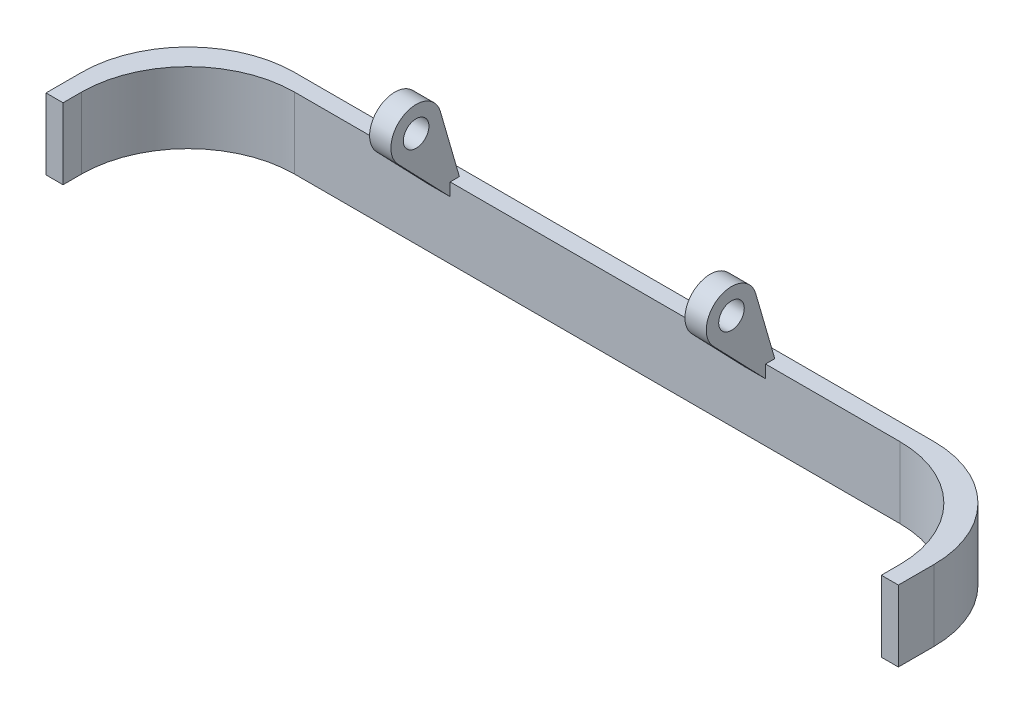
ISO-10303-21;
HEADER;
FILE_DESCRIPTION(('STEP AP214'),'2;1');
FILE_NAME('part.step','',(''),(''),'','','');
FILE_SCHEMA(('AUTOMOTIVE_DESIGN { 1 0 10303 214 1 1 1 1 }'));
ENDSEC;
DATA;
#1=APPLICATION_CONTEXT('core data for automotive mechanical design processes');
#2=APPLICATION_PROTOCOL_DEFINITION('international standard','automotive_design',2000,#1);
#3=PRODUCT_CONTEXT('',#1,'mechanical');
#4=PRODUCT('Part','Part','',(#3));
#5=PRODUCT_RELATED_PRODUCT_CATEGORY('part','',(#4));
#6=PRODUCT_DEFINITION_FORMATION('','',#4);
#7=PRODUCT_DEFINITION_CONTEXT('part definition',#1,'design');
#8=PRODUCT_DEFINITION('design','',#6,#7);
#9=PRODUCT_DEFINITION_SHAPE('','',#8);
#10=(LENGTH_UNIT() NAMED_UNIT(*) SI_UNIT(.MILLI.,.METRE.));
#11=(NAMED_UNIT(*) PLANE_ANGLE_UNIT() SI_UNIT($,.RADIAN.));
#12=(NAMED_UNIT(*) SI_UNIT($,.STERADIAN.) SOLID_ANGLE_UNIT());
#13=UNCERTAINTY_MEASURE_WITH_UNIT(LENGTH_MEASURE(1.E-05),#10,'distance_accuracy_value','');
#14=(GEOMETRIC_REPRESENTATION_CONTEXT(3) GLOBAL_UNCERTAINTY_ASSIGNED_CONTEXT((#13)) GLOBAL_UNIT_ASSIGNED_CONTEXT((#10,
#11,#12)) REPRESENTATION_CONTEXT('',''));
#15=CARTESIAN_POINT('',(0.,0.,0.));
#16=DIRECTION('',(0.,0.,1.));
#17=DIRECTION('',(1.,0.,0.));
#18=AXIS2_PLACEMENT_3D('',#15,#16,#17);
#19=CARTESIAN_POINT('',(17.4,10.,-17.6));
#20=DIRECTION('',(0.,0.,-1.));
#21=DIRECTION('',(-1.,0.,0.));
#22=AXIS2_PLACEMENT_3D('',#19,#20,#21);
#23=PLANE('',#22);
#24=DIRECTION('',(1.,0.,0.));
#25=VECTOR('',#24,1.);
#26=CARTESIAN_POINT('',(36.3,8.19852648959341,-17.599999999959));
#27=LINE('',#26,#25);
#28=CARTESIAN_POINT('',(36.3,8.19852648946349,-17.6));
#29=VERTEX_POINT('',#28);
#30=CARTESIAN_POINT('',(39.3,8.19852648959341,-17.6));
#31=VERTEX_POINT('',#30);
#32=EDGE_CURVE('E97',#29,#31,#27,.T.);
#33=ORIENTED_EDGE('',*,*,#32,.F.);
#34=DIRECTION('',(0.,1.,0.));
#35=VECTOR('',#34,1.);
#36=CARTESIAN_POINT('',(36.3,-291577.437540496,-17.6000000000158));
#37=LINE('',#36,#35);
#38=CARTESIAN_POINT('',(36.3,10.,-17.6));
#39=VERTEX_POINT('',#38);
#40=EDGE_CURVE('E257',#29,#39,#37,.T.);
#41=ORIENTED_EDGE('',*,*,#40,.T.);
#42=DIRECTION('',(1.,0.,0.));
#43=VECTOR('',#42,1.);
#44=CARTESIAN_POINT('',(17.4,10.,-17.6));
#45=LINE('',#44,#43);
#46=CARTESIAN_POINT('',(17.4,10.,-17.6));
#47=VERTEX_POINT('',#46);
#48=EDGE_CURVE('E320',#47,#39,#45,.T.);
#49=ORIENTED_EDGE('',*,*,#48,.F.);
#50=DIRECTION('',(0.,-1.,0.));
#51=VECTOR('',#50,1.);
#52=CARTESIAN_POINT('',(17.4,10.,-17.6));
#53=LINE('',#52,#51);
#54=CARTESIAN_POINT('',(17.4,0.,-17.6));
#55=VERTEX_POINT('',#54);
#56=EDGE_CURVE('E390',#47,#55,#53,.T.);
#57=ORIENTED_EDGE('',*,*,#56,.T.);
#58=DIRECTION('',(1.,0.,0.));
#59=VECTOR('',#58,1.);
#60=CARTESIAN_POINT('',(17.4,0.,-17.6));
#61=LINE('',#60,#59);
#62=CARTESIAN_POINT('',(102.6,0.,-17.6));
#63=VERTEX_POINT('',#62);
#64=EDGE_CURVE('E347',#55,#63,#61,.T.);
#65=ORIENTED_EDGE('',*,*,#64,.T.);
#66=DIRECTION('',(0.,-1.,0.));
#67=VECTOR('',#66,1.);
#68=CARTESIAN_POINT('',(102.6,10.,-17.6));
#69=LINE('',#68,#67);
#70=CARTESIAN_POINT('',(102.6,10.,-17.6));
#71=VERTEX_POINT('',#70);
#72=EDGE_CURVE('E387',#71,#63,#69,.T.);
#73=ORIENTED_EDGE('',*,*,#72,.F.);
#74=CARTESIAN_POINT('',(83.7,10.,-17.6));
#75=VERTEX_POINT('',#74);
#76=EDGE_CURVE('E319',#75,#71,#45,.T.);
#77=ORIENTED_EDGE('',*,*,#76,.F.);
#78=DIRECTION('',(0.,-1.,0.));
#79=VECTOR('',#78,1.);
#80=CARTESIAN_POINT('',(83.7,0.,-17.6));
#81=LINE('',#80,#79);
#82=CARTESIAN_POINT('',(83.7,8.19852648953336,-17.6));
#83=VERTEX_POINT('',#82);
#84=EDGE_CURVE('E284',#75,#83,#81,.T.);
#85=ORIENTED_EDGE('',*,*,#84,.T.);
#86=DIRECTION('',(-1.,0.,0.));
#87=VECTOR('',#86,1.);
#88=CARTESIAN_POINT('',(83.7,8.19852648953336,-17.6));
#89=LINE('',#88,#87);
#90=CARTESIAN_POINT('',(80.7,8.19852648953336,-17.6));
#91=VERTEX_POINT('',#90);
#92=EDGE_CURVE('E303',#83,#91,#89,.T.);
#93=ORIENTED_EDGE('',*,*,#92,.T.);
#94=DIRECTION('',(0.,-1.,0.));
#95=VECTOR('',#94,1.);
#96=CARTESIAN_POINT('',(80.7,0.,-17.6));
#97=LINE('',#96,#95);
#98=CARTESIAN_POINT('',(80.7,10.,-17.6));
#99=VERTEX_POINT('',#98);
#100=EDGE_CURVE('E297',#99,#91,#97,.T.);
#101=ORIENTED_EDGE('',*,*,#100,.F.);
#102=CARTESIAN_POINT('',(39.3,10.,-17.6));
#103=VERTEX_POINT('',#102);
#104=EDGE_CURVE('E324',#103,#99,#45,.T.);
#105=ORIENTED_EDGE('',*,*,#104,.F.);
#106=DIRECTION('',(0.,1.,0.));
#107=VECTOR('',#106,1.);
#108=CARTESIAN_POINT('',(39.3,-291577.437540496,-17.6000000000158));
#109=LINE('',#108,#107);
#110=EDGE_CURVE('E102',#31,#103,#109,.T.);
#111=ORIENTED_EDGE('',*,*,#110,.F.);
#112=EDGE_LOOP('',(#33,#41,#49,#57,#65,#73,#77,#85,#93,#101,#105,#111));
#113=FACE_BOUND('',#112,.T.);
#114=ADVANCED_FACE('F81',(#113),#23,.F.);
#115=CARTESIAN_POINT('',(15.,10.,-5.));
#116=DIRECTION('',(0.,-1.,0.));
#117=DIRECTION('',(0.,0.,-1.));
#118=AXIS2_PLACEMENT_3D('',#115,#116,#117);
#119=PLANE('',#118);
#120=ORIENTED_EDGE('',*,*,#48,.T.);
#121=DIRECTION('',(0.,0.,1.));
#122=VECTOR('',#121,1.);
#123=CARTESIAN_POINT('',(36.3,9.99999999999091,-400012.724171979));
#124=LINE('',#123,#122);
#125=CARTESIAN_POINT('',(36.3,10.,-18.9000000000499));
#126=VERTEX_POINT('',#125);
#127=EDGE_CURVE('E255',#126,#39,#124,.T.);
#128=ORIENTED_EDGE('',*,*,#127,.F.);
#129=DIRECTION('',(1.,0.,0.));
#130=VECTOR('',#129,1.);
#131=CARTESIAN_POINT('',(36.3,9.99999999999091,-18.9000000000306));
#132=LINE('',#131,#130);
#133=CARTESIAN_POINT('',(39.3,9.99999999999091,-18.9000000000306));
#134=VERTEX_POINT('',#133);
#135=EDGE_CURVE('E252',#126,#134,#132,.T.);
#136=ORIENTED_EDGE('',*,*,#135,.T.);
#137=DIRECTION('',(0.,0.,1.));
#138=VECTOR('',#137,1.);
#139=CARTESIAN_POINT('',(39.3,9.99999999999091,-400012.724171979));
#140=LINE('',#139,#138);
#141=EDGE_CURVE('E263',#134,#103,#140,.T.);
#142=ORIENTED_EDGE('',*,*,#141,.T.);
#143=ORIENTED_EDGE('',*,*,#104,.T.);
#144=DIRECTION('',(0.,0.,-1.));
#145=VECTOR('',#144,1.);
#146=CARTESIAN_POINT('',(80.7,10.,0.));
#147=LINE('',#146,#145);
#148=CARTESIAN_POINT('',(80.7,10.,-18.9));
#149=VERTEX_POINT('',#148);
#150=EDGE_CURVE('E279',#99,#149,#147,.T.);
#151=ORIENTED_EDGE('',*,*,#150,.T.);
#152=DIRECTION('',(-1.,0.,0.));
#153=VECTOR('',#152,1.);
#154=CARTESIAN_POINT('',(83.7,10.,-18.9));
#155=LINE('',#154,#153);
#156=CARTESIAN_POINT('',(83.7,10.,-18.9));
#157=VERTEX_POINT('',#156);
#158=EDGE_CURVE('E289',#157,#149,#155,.T.);
#159=ORIENTED_EDGE('',*,*,#158,.F.);
#160=DIRECTION('',(0.,0.,-1.));
#161=VECTOR('',#160,1.);
#162=CARTESIAN_POINT('',(83.7,10.,0.));
#163=LINE('',#162,#161);
#164=EDGE_CURVE('E287',#75,#157,#163,.T.);
#165=ORIENTED_EDGE('',*,*,#164,.F.);
#166=ORIENTED_EDGE('',*,*,#76,.T.);
#167=CARTESIAN_POINT('',(102.6,10.,-2.6));
#168=DIRECTION('',(0.,-1.,0.));
#169=DIRECTION('',(0.,0.,-1.));
#170=AXIS2_PLACEMENT_3D('',#167,#168,#169);
#171=CIRCLE('',#170,15.);
#172=CARTESIAN_POINT('',(117.6,10.,-2.6));
#173=VERTEX_POINT('',#172);
#174=EDGE_CURVE('E323',#71,#173,#171,.T.);
#175=ORIENTED_EDGE('',*,*,#174,.T.);
#176=DIRECTION('',(0.,0.,1.));
#177=VECTOR('',#176,1.);
#178=CARTESIAN_POINT('',(117.6,10.,-2.6));
#179=LINE('',#178,#177);
#180=CARTESIAN_POINT('',(117.6,10.,0.));
#181=VERTEX_POINT('',#180);
#182=EDGE_CURVE('E326',#173,#181,#179,.T.);
#183=ORIENTED_EDGE('',*,*,#182,.T.);
#184=DIRECTION('',(1.,0.,0.));
#185=VECTOR('',#184,1.);
#186=CARTESIAN_POINT('',(120.,10.,0.));
#187=LINE('',#186,#185);
#188=CARTESIAN_POINT('',(120.,10.,0.));
#189=VERTEX_POINT('',#188);
#190=EDGE_CURVE('E328',#181,#189,#187,.T.);
#191=ORIENTED_EDGE('',*,*,#190,.T.);
#192=DIRECTION('',(0.,0.,-1.));
#193=VECTOR('',#192,1.);
#194=CARTESIAN_POINT('',(120.,10.,-5.));
#195=LINE('',#194,#193);
#196=CARTESIAN_POINT('',(120.,10.,-5.));
#197=VERTEX_POINT('',#196);
#198=EDGE_CURVE('E330',#189,#197,#195,.T.);
#199=ORIENTED_EDGE('',*,*,#198,.T.);
#200=CARTESIAN_POINT('',(105.,10.,-5.));
#201=DIRECTION('',(0.,1.,0.));
#202=DIRECTION('',(0.,0.,-1.));
#203=AXIS2_PLACEMENT_3D('',#200,#201,#202);
#204=CIRCLE('',#203,15.);
#205=CARTESIAN_POINT('',(105.,10.,-20.));
#206=VERTEX_POINT('',#205);
#207=EDGE_CURVE('E332',#197,#206,#204,.T.);
#208=ORIENTED_EDGE('',*,*,#207,.T.);
#209=DIRECTION('',(-1.,0.,0.));
#210=VECTOR('',#209,1.);
#211=CARTESIAN_POINT('',(15.,10.,-20.));
#212=LINE('',#211,#210);
#213=CARTESIAN_POINT('',(15.,10.,-20.));
#214=VERTEX_POINT('',#213);
#215=EDGE_CURVE('E334',#206,#214,#212,.T.);
#216=ORIENTED_EDGE('',*,*,#215,.T.);
#217=CARTESIAN_POINT('',(15.,10.,-5.));
#218=DIRECTION('',(0.,1.,0.));
#219=DIRECTION('',(0.,0.,-1.));
#220=AXIS2_PLACEMENT_3D('',#217,#218,#219);
#221=CIRCLE('',#220,15.);
#222=CARTESIAN_POINT('',(0.,10.,-5.));
#223=VERTEX_POINT('',#222);
#224=EDGE_CURVE('E336',#214,#223,#221,.T.);
#225=ORIENTED_EDGE('',*,*,#224,.T.);
#226=DIRECTION('',(0.,0.,1.));
#227=VECTOR('',#226,1.);
#228=CARTESIAN_POINT('',(0.,10.,0.));
#229=LINE('',#228,#227);
#230=CARTESIAN_POINT('',(0.,10.,0.));
#231=VERTEX_POINT('',#230);
#232=EDGE_CURVE('E338',#223,#231,#229,.T.);
#233=ORIENTED_EDGE('',*,*,#232,.T.);
#234=DIRECTION('',(1.,0.,0.));
#235=VECTOR('',#234,1.);
#236=CARTESIAN_POINT('',(2.4,10.,0.));
#237=LINE('',#236,#235);
#238=CARTESIAN_POINT('',(2.4,10.,0.));
#239=VERTEX_POINT('',#238);
#240=EDGE_CURVE('E311',#231,#239,#237,.T.);
#241=ORIENTED_EDGE('',*,*,#240,.T.);
#242=DIRECTION('',(0.,0.,-1.));
#243=VECTOR('',#242,1.);
#244=CARTESIAN_POINT('',(2.4,10.,0.));
#245=LINE('',#244,#243);
#246=CARTESIAN_POINT('',(2.4,10.,-2.6));
#247=VERTEX_POINT('',#246);
#248=EDGE_CURVE('E314',#239,#247,#245,.T.);
#249=ORIENTED_EDGE('',*,*,#248,.T.);
#250=CARTESIAN_POINT('',(17.4,10.,-2.6));
#251=DIRECTION('',(0.,-1.,0.));
#252=DIRECTION('',(0.,0.,-1.));
#253=AXIS2_PLACEMENT_3D('',#250,#251,#252);
#254=CIRCLE('',#253,15.);
#255=EDGE_CURVE('E317',#247,#47,#254,.T.);
#256=ORIENTED_EDGE('',*,*,#255,.T.);
#257=EDGE_LOOP('',(#120,#128,#136,#142,#143,#151,#159,#165,#166,#175,#183,#191,#199,#208,#216,
#225,#233,#241,#249,#256));
#258=FACE_BOUND('',#257,.T.);
#259=ADVANCED_FACE('F416',(#258),#119,.F.);
#260=CARTESIAN_POINT('',(2.4,10.,0.));
#261=DIRECTION('',(0.,0.,-1.));
#262=DIRECTION('',(-1.,0.,0.));
#263=AXIS2_PLACEMENT_3D('',#260,#261,#262);
#264=PLANE('',#263);
#265=DIRECTION('',(1.,0.,0.));
#266=VECTOR('',#265,1.);
#267=CARTESIAN_POINT('',(2.4,0.,0.));
#268=LINE('',#267,#266);
#269=CARTESIAN_POINT('',(0.,0.,0.));
#270=VERTEX_POINT('',#269);
#271=CARTESIAN_POINT('',(2.4,0.,0.));
#272=VERTEX_POINT('',#271);
#273=EDGE_CURVE('E310',#270,#272,#268,.T.);
#274=ORIENTED_EDGE('',*,*,#273,.T.);
#275=DIRECTION('',(0.,-1.,0.));
#276=VECTOR('',#275,1.);
#277=CARTESIAN_POINT('',(2.4,10.,0.));
#278=LINE('',#277,#276);
#279=EDGE_CURVE('E12',#239,#272,#278,.T.);
#280=ORIENTED_EDGE('',*,*,#279,.F.);
#281=ORIENTED_EDGE('',*,*,#240,.F.);
#282=DIRECTION('',(0.,-1.,0.));
#283=VECTOR('',#282,1.);
#284=CARTESIAN_POINT('',(0.,10.,0.));
#285=LINE('',#284,#283);
#286=EDGE_CURVE('E340',#231,#270,#285,.T.);
#287=ORIENTED_EDGE('',*,*,#286,.T.);
#288=EDGE_LOOP('',(#274,#280,#281,#287));
#289=FACE_BOUND('',#288,.T.);
#290=ADVANCED_FACE('F83',(#289),#264,.F.);
#291=CARTESIAN_POINT('',(2.4,10.,0.));
#292=DIRECTION('',(-1.,0.,0.));
#293=DIRECTION('',(0.,0.,1.));
#294=AXIS2_PLACEMENT_3D('',#291,#292,#293);
#295=PLANE('',#294);
#296=DIRECTION('',(0.,0.,-1.));
#297=VECTOR('',#296,1.);
#298=CARTESIAN_POINT('',(2.4,0.,0.));
#299=LINE('',#298,#297);
#300=CARTESIAN_POINT('',(2.4,0.,-2.6));
#301=VERTEX_POINT('',#300);
#302=EDGE_CURVE('E343',#272,#301,#299,.T.);
#303=ORIENTED_EDGE('',*,*,#302,.T.);
#304=DIRECTION('',(0.,-1.,0.));
#305=VECTOR('',#304,1.);
#306=CARTESIAN_POINT('',(2.4,10.,-2.6));
#307=LINE('',#306,#305);
#308=EDGE_CURVE('E90',#247,#301,#307,.T.);
#309=ORIENTED_EDGE('',*,*,#308,.F.);
#310=ORIENTED_EDGE('',*,*,#248,.F.);
#311=ORIENTED_EDGE('',*,*,#279,.T.);
#312=EDGE_LOOP('',(#303,#309,#310,#311));
#313=FACE_BOUND('',#312,.T.);
#314=ADVANCED_FACE('F467',(#313),#295,.F.);
#315=CARTESIAN_POINT('',(17.4,10.,-2.6));
#316=DIRECTION('',(0.,-1.,0.));
#317=DIRECTION('',(0.,0.,-1.));
#318=AXIS2_PLACEMENT_3D('',#315,#316,#317);
#319=CYLINDRICAL_SURFACE('',#318,15.);
#320=CARTESIAN_POINT('',(17.4,0.,-2.6));
#321=DIRECTION('',(0.,-1.,0.));
#322=DIRECTION('',(0.,0.,-1.));
#323=AXIS2_PLACEMENT_3D('',#320,#321,#322);
#324=CIRCLE('',#323,15.);
#325=EDGE_CURVE('E345',#301,#55,#324,.T.);
#326=ORIENTED_EDGE('',*,*,#325,.T.);
#327=ORIENTED_EDGE('',*,*,#56,.F.);
#328=ORIENTED_EDGE('',*,*,#255,.F.);
#329=ORIENTED_EDGE('',*,*,#308,.T.);
#330=EDGE_LOOP('',(#326,#327,#328,#329));
#331=FACE_BOUND('',#330,.T.);
#332=ADVANCED_FACE('F398',(#331),#319,.F.);
#333=CARTESIAN_POINT('',(102.6,10.,-2.6));
#334=DIRECTION('',(0.,-1.,0.));
#335=DIRECTION('',(0.,0.,-1.));
#336=AXIS2_PLACEMENT_3D('',#333,#334,#335);
#337=CYLINDRICAL_SURFACE('',#336,15.);
#338=CARTESIAN_POINT('',(102.6,0.,-2.6));
#339=DIRECTION('',(0.,-1.,0.));
#340=DIRECTION('',(0.,0.,-1.));
#341=AXIS2_PLACEMENT_3D('',#338,#339,#340);
#342=CIRCLE('',#341,15.);
#343=CARTESIAN_POINT('',(117.6,0.,-2.6));
#344=VERTEX_POINT('',#343);
#345=EDGE_CURVE('E349',#63,#344,#342,.T.);
#346=ORIENTED_EDGE('',*,*,#345,.T.);
#347=DIRECTION('',(0.,-1.,0.));
#348=VECTOR('',#347,1.);
#349=CARTESIAN_POINT('',(117.6,10.,-2.6));
#350=LINE('',#349,#348);
#351=EDGE_CURVE('E384',#173,#344,#350,.T.);
#352=ORIENTED_EDGE('',*,*,#351,.F.);
#353=ORIENTED_EDGE('',*,*,#174,.F.);
#354=ORIENTED_EDGE('',*,*,#72,.T.);
#355=EDGE_LOOP('',(#346,#352,#353,#354));
#356=FACE_BOUND('',#355,.T.);
#357=ADVANCED_FACE('F412',(#356),#337,.F.);
#358=CARTESIAN_POINT('',(117.6,10.,-2.6));
#359=DIRECTION('',(1.,0.,0.));
#360=DIRECTION('',(0.,0.,-1.));
#361=AXIS2_PLACEMENT_3D('',#358,#359,#360);
#362=PLANE('',#361);
#363=DIRECTION('',(0.,0.,1.));
#364=VECTOR('',#363,1.);
#365=CARTESIAN_POINT('',(117.6,0.,-2.6));
#366=LINE('',#365,#364);
#367=CARTESIAN_POINT('',(117.6,0.,0.));
#368=VERTEX_POINT('',#367);
#369=EDGE_CURVE('E351',#344,#368,#366,.T.);
#370=ORIENTED_EDGE('',*,*,#369,.T.);
#371=DIRECTION('',(0.,-1.,0.));
#372=VECTOR('',#371,1.);
#373=CARTESIAN_POINT('',(117.6,10.,0.));
#374=LINE('',#373,#372);
#375=EDGE_CURVE('E381',#181,#368,#374,.T.);
#376=ORIENTED_EDGE('',*,*,#375,.F.);
#377=ORIENTED_EDGE('',*,*,#182,.F.);
#378=ORIENTED_EDGE('',*,*,#351,.T.);
#379=EDGE_LOOP('',(#370,#376,#377,#378));
#380=FACE_BOUND('',#379,.T.);
#381=ADVANCED_FACE('F505',(#380),#362,.F.);
#382=CARTESIAN_POINT('',(120.,10.,0.));
#383=DIRECTION('',(0.,0.,-1.));
#384=DIRECTION('',(-1.,0.,0.));
#385=AXIS2_PLACEMENT_3D('',#382,#383,#384);
#386=PLANE('',#385);
#387=DIRECTION('',(1.,0.,0.));
#388=VECTOR('',#387,1.);
#389=CARTESIAN_POINT('',(120.,0.,0.));
#390=LINE('',#389,#388);
#391=CARTESIAN_POINT('',(120.,0.,0.));
#392=VERTEX_POINT('',#391);
#393=EDGE_CURVE('E353',#368,#392,#390,.T.);
#394=ORIENTED_EDGE('',*,*,#393,.T.);
#395=DIRECTION('',(0.,-1.,0.));
#396=VECTOR('',#395,1.);
#397=CARTESIAN_POINT('',(120.,10.,0.));
#398=LINE('',#397,#396);
#399=EDGE_CURVE('E378',#189,#392,#398,.T.);
#400=ORIENTED_EDGE('',*,*,#399,.F.);
#401=ORIENTED_EDGE('',*,*,#190,.F.);
#402=ORIENTED_EDGE('',*,*,#375,.T.);
#403=EDGE_LOOP('',(#394,#400,#401,#402));
#404=FACE_BOUND('',#403,.T.);
#405=ADVANCED_FACE('F503',(#404),#386,.F.);
#406=CARTESIAN_POINT('',(120.,10.,-5.));
#407=DIRECTION('',(-1.,0.,0.));
#408=DIRECTION('',(0.,0.,1.));
#409=AXIS2_PLACEMENT_3D('',#406,#407,#408);
#410=PLANE('',#409);
#411=DIRECTION('',(0.,0.,-1.));
#412=VECTOR('',#411,1.);
#413=CARTESIAN_POINT('',(120.,0.,-5.));
#414=LINE('',#413,#412);
#415=CARTESIAN_POINT('',(120.,0.,-5.));
#416=VERTEX_POINT('',#415);
#417=EDGE_CURVE('E355',#392,#416,#414,.T.);
#418=ORIENTED_EDGE('',*,*,#417,.T.);
#419=DIRECTION('',(0.,-1.,0.));
#420=VECTOR('',#419,1.);
#421=CARTESIAN_POINT('',(120.,10.,-5.));
#422=LINE('',#421,#420);
#423=EDGE_CURVE('E375',#197,#416,#422,.T.);
#424=ORIENTED_EDGE('',*,*,#423,.F.);
#425=ORIENTED_EDGE('',*,*,#198,.F.);
#426=ORIENTED_EDGE('',*,*,#399,.T.);
#427=EDGE_LOOP('',(#418,#424,#425,#426));
#428=FACE_BOUND('',#427,.T.);
#429=ADVANCED_FACE('F499',(#428),#410,.F.);
#430=CARTESIAN_POINT('',(105.,10.,-5.));
#431=DIRECTION('',(0.,-1.,0.));
#432=DIRECTION('',(0.,0.,-1.));
#433=AXIS2_PLACEMENT_3D('',#430,#431,#432);
#434=CYLINDRICAL_SURFACE('',#433,15.);
#435=CARTESIAN_POINT('',(105.,0.,-5.));
#436=DIRECTION('',(0.,1.,0.));
#437=DIRECTION('',(0.,0.,-1.));
#438=AXIS2_PLACEMENT_3D('',#435,#436,#437);
#439=CIRCLE('',#438,15.);
#440=CARTESIAN_POINT('',(105.,0.,-20.));
#441=VERTEX_POINT('',#440);
#442=EDGE_CURVE('E357',#416,#441,#439,.T.);
#443=ORIENTED_EDGE('',*,*,#442,.T.);
#444=DIRECTION('',(0.,-1.,0.));
#445=VECTOR('',#444,1.);
#446=CARTESIAN_POINT('',(105.,10.,-20.));
#447=LINE('',#446,#445);
#448=EDGE_CURVE('E372',#206,#441,#447,.T.);
#449=ORIENTED_EDGE('',*,*,#448,.F.);
#450=ORIENTED_EDGE('',*,*,#207,.F.);
#451=ORIENTED_EDGE('',*,*,#423,.T.);
#452=EDGE_LOOP('',(#443,#449,#450,#451));
#453=FACE_BOUND('',#452,.T.);
#454=ADVANCED_FACE('F494',(#453),#434,.T.);
#455=CARTESIAN_POINT('',(15.,10.,-20.));
#456=DIRECTION('',(0.,0.,1.));
#457=DIRECTION('',(1.,0.,0.));
#458=AXIS2_PLACEMENT_3D('',#455,#456,#457);
#459=PLANE('',#458);
#460=DIRECTION('',(-1.,0.,0.));
#461=VECTOR('',#460,1.);
#462=CARTESIAN_POINT('',(15.,0.,-20.));
#463=LINE('',#462,#461);
#464=CARTESIAN_POINT('',(15.,0.,-20.));
#465=VERTEX_POINT('',#464);
#466=EDGE_CURVE('E359',#441,#465,#463,.T.);
#467=ORIENTED_EDGE('',*,*,#466,.T.);
#468=DIRECTION('',(0.,-1.,0.));
#469=VECTOR('',#468,1.);
#470=CARTESIAN_POINT('',(15.,10.,-20.));
#471=LINE('',#470,#469);
#472=EDGE_CURVE('E369',#214,#465,#471,.T.);
#473=ORIENTED_EDGE('',*,*,#472,.F.);
#474=ORIENTED_EDGE('',*,*,#215,.F.);
#475=ORIENTED_EDGE('',*,*,#448,.T.);
#476=EDGE_LOOP('',(#467,#473,#474,#475));
#477=FACE_BOUND('',#476,.T.);
#478=ADVANCED_FACE('F488',(#477),#459,.F.);
#479=CARTESIAN_POINT('',(15.,10.,-5.));
#480=DIRECTION('',(0.,-1.,0.));
#481=DIRECTION('',(0.,0.,-1.));
#482=AXIS2_PLACEMENT_3D('',#479,#480,#481);
#483=CYLINDRICAL_SURFACE('',#482,15.);
#484=CARTESIAN_POINT('',(15.,0.,-5.));
#485=DIRECTION('',(0.,1.,0.));
#486=DIRECTION('',(0.,0.,-1.));
#487=AXIS2_PLACEMENT_3D('',#484,#485,#486);
#488=CIRCLE('',#487,15.);
#489=CARTESIAN_POINT('',(0.,0.,-5.));
#490=VERTEX_POINT('',#489);
#491=EDGE_CURVE('E361',#465,#490,#488,.T.);
#492=ORIENTED_EDGE('',*,*,#491,.T.);
#493=DIRECTION('',(0.,-1.,0.));
#494=VECTOR('',#493,1.);
#495=CARTESIAN_POINT('',(0.,10.,-5.));
#496=LINE('',#495,#494);
#497=EDGE_CURVE('E366',#223,#490,#496,.T.);
#498=ORIENTED_EDGE('',*,*,#497,.F.);
#499=ORIENTED_EDGE('',*,*,#224,.F.);
#500=ORIENTED_EDGE('',*,*,#472,.T.);
#501=EDGE_LOOP('',(#492,#498,#499,#500));
#502=FACE_BOUND('',#501,.T.);
#503=ADVANCED_FACE('F484',(#502),#483,.T.);
#504=CARTESIAN_POINT('',(0.,10.,0.));
#505=DIRECTION('',(1.,0.,0.));
#506=DIRECTION('',(0.,0.,-1.));
#507=AXIS2_PLACEMENT_3D('',#504,#505,#506);
#508=PLANE('',#507);
#509=DIRECTION('',(0.,0.,1.));
#510=VECTOR('',#509,1.);
#511=CARTESIAN_POINT('',(0.,0.,0.));
#512=LINE('',#511,#510);
#513=EDGE_CURVE('E315',#490,#270,#512,.T.);
#514=ORIENTED_EDGE('',*,*,#513,.T.);
#515=ORIENTED_EDGE('',*,*,#286,.F.);
#516=ORIENTED_EDGE('',*,*,#232,.F.);
#517=ORIENTED_EDGE('',*,*,#497,.T.);
#518=EDGE_LOOP('',(#514,#515,#516,#517));
#519=FACE_BOUND('',#518,.T.);
#520=ADVANCED_FACE('F448',(#519),#508,.F.);
#521=CARTESIAN_POINT('',(15.,0.,-5.));
#522=DIRECTION('',(0.,-1.,0.));
#523=DIRECTION('',(0.,0.,-1.));
#524=AXIS2_PLACEMENT_3D('',#521,#522,#523);
#525=PLANE('',#524);
#526=ORIENTED_EDGE('',*,*,#273,.F.);
#527=ORIENTED_EDGE('',*,*,#513,.F.);
#528=ORIENTED_EDGE('',*,*,#491,.F.);
#529=ORIENTED_EDGE('',*,*,#466,.F.);
#530=ORIENTED_EDGE('',*,*,#442,.F.);
#531=ORIENTED_EDGE('',*,*,#417,.F.);
#532=ORIENTED_EDGE('',*,*,#393,.F.);
#533=ORIENTED_EDGE('',*,*,#369,.F.);
#534=ORIENTED_EDGE('',*,*,#345,.F.);
#535=ORIENTED_EDGE('',*,*,#64,.F.);
#536=ORIENTED_EDGE('',*,*,#325,.F.);
#537=ORIENTED_EDGE('',*,*,#302,.F.);
#538=EDGE_LOOP('',(#526,#527,#528,#529,#530,#531,#532,#533,#534,#535,#536,#537));
#539=FACE_BOUND('',#538,.T.);
#540=ADVANCED_FACE('F404',(#539),#525,.T.);
#541=CARTESIAN_POINT('',(83.7,18.3,-12.8079927657261));
#542=DIRECTION('',(-1.,0.,0.));
#543=DIRECTION('',(0.,0.,1.));
#544=AXIS2_PLACEMENT_3D('',#541,#542,#543);
#545=CYLINDRICAL_SURFACE('',#544,3.55);
#546=CARTESIAN_POINT('',(80.7,18.3,-12.8079927657261));
#547=DIRECTION('',(1.,0.,0.));
#548=DIRECTION('',(0.,0.,-1.));
#549=AXIS2_PLACEMENT_3D('',#546,#547,#548);
#550=CIRCLE('',#549,3.55);
#551=CARTESIAN_POINT('',(80.7,19.2849476783984,-16.2186199911522));
#552=VERTEX_POINT('',#551);
#553=CARTESIAN_POINT('',(80.7,15.8387840191414,-10.2496894421215));
#554=VERTEX_POINT('',#553);
#555=EDGE_CURVE('E292',#552,#554,#550,.T.);
#556=ORIENTED_EDGE('',*,*,#555,.T.);
#557=DIRECTION('',(-1.,0.,0.));
#558=VECTOR('',#557,1.);
#559=CARTESIAN_POINT('',(83.7,15.8387840191414,-10.2496894421215));
#560=LINE('',#559,#558);
#561=CARTESIAN_POINT('',(83.7,15.8387840191414,-10.2496894421215));
#562=VERTEX_POINT('',#561);
#563=EDGE_CURVE('E306',#562,#554,#560,.T.);
#564=ORIENTED_EDGE('',*,*,#563,.F.);
#565=CARTESIAN_POINT('',(83.7,18.3,-12.8079927657261));
#566=DIRECTION('',(1.,0.,0.));
#567=DIRECTION('',(0.,0.,-1.));
#568=AXIS2_PLACEMENT_3D('',#565,#566,#567);
#569=CIRCLE('',#568,3.55);
#570=CARTESIAN_POINT('',(83.7,19.2849476783984,-16.2186199911522));
#571=VERTEX_POINT('',#570);
#572=EDGE_CURVE('E278',#571,#562,#569,.T.);
#573=ORIENTED_EDGE('',*,*,#572,.F.);
#574=DIRECTION('',(-1.,0.,0.));
#575=VECTOR('',#574,1.);
#576=CARTESIAN_POINT('',(83.7,19.2849476783984,-16.2186199911522));
#577=LINE('',#576,#575);
#578=EDGE_CURVE('E308',#571,#552,#577,.T.);
#579=ORIENTED_EDGE('',*,*,#578,.T.);
#580=EDGE_LOOP('',(#556,#564,#573,#579));
#581=FACE_BOUND('',#580,.T.);
#582=ADVANCED_FACE('F439',(#581),#545,.T.);
#583=CARTESIAN_POINT('',(83.7,5.80771976503237,-20.1106795646983));
#584=DIRECTION('',(0.,-0.277450050253081,0.960740063500301));
#585=DIRECTION('',(0.,-0.960740063500301,-0.277450050253081));
#586=AXIS2_PLACEMENT_3D('',#583,#584,#585);
#587=PLANE('',#586);
#588=DIRECTION('',(0.,0.960740063500301,0.277450050253081));
#589=VECTOR('',#588,1.);
#590=CARTESIAN_POINT('',(80.7,5.80771976503237,-20.1106795646983));
#591=LINE('',#590,#589);
#592=EDGE_CURVE('E272',#149,#552,#591,.T.);
#593=ORIENTED_EDGE('',*,*,#592,.T.);
#594=ORIENTED_EDGE('',*,*,#578,.F.);
#595=DIRECTION('',(0.,0.960740063500301,0.277450050253081));
#596=VECTOR('',#595,1.);
#597=CARTESIAN_POINT('',(83.7,5.80771976503237,-20.1106795646983));
#598=LINE('',#597,#596);
#599=EDGE_CURVE('E275',#157,#571,#598,.T.);
#600=ORIENTED_EDGE('',*,*,#599,.F.);
#601=ORIENTED_EDGE('',*,*,#158,.T.);
#602=EDGE_LOOP('',(#593,#594,#600,#601));
#603=FACE_BOUND('',#602,.T.);
#604=ADVANCED_FACE('F434',(#603),#587,.F.);
#605=CARTESIAN_POINT('',(83.7,12.7341650755094,-13.2364884225401));
#606=DIRECTION('',(0.,0.693300276298192,-0.720648823550591));
#607=DIRECTION('',(0.,0.720648823550591,0.693300276298192));
#608=AXIS2_PLACEMENT_3D('',#605,#606,#607);
#609=PLANE('',#608);
#610=DIRECTION('',(0.,-0.720648823550591,-0.693300276298192));
#611=VECTOR('',#610,1.);
#612=CARTESIAN_POINT('',(80.7,12.7341650755094,-13.2364884225401));
#613=LINE('',#612,#611);
#614=EDGE_CURVE('E295',#554,#91,#613,.T.);
#615=ORIENTED_EDGE('',*,*,#614,.T.);
#616=ORIENTED_EDGE('',*,*,#92,.F.);
#617=DIRECTION('',(0.,-0.720648823550591,-0.693300276298192));
#618=VECTOR('',#617,1.);
#619=CARTESIAN_POINT('',(83.7,12.7341650755094,-13.2364884225401));
#620=LINE('',#619,#618);
#621=EDGE_CURVE('E282',#562,#83,#620,.T.);
#622=ORIENTED_EDGE('',*,*,#621,.F.);
#623=ORIENTED_EDGE('',*,*,#563,.T.);
#624=EDGE_LOOP('',(#615,#616,#622,#623));
#625=FACE_BOUND('',#624,.T.);
#626=ADVANCED_FACE('F431',(#625),#609,.F.);
#627=CARTESIAN_POINT('',(80.7,0.,0.));
#628=DIRECTION('',(1.,0.,0.));
#629=DIRECTION('',(0.,0.,-1.));
#630=AXIS2_PLACEMENT_3D('',#627,#628,#629);
#631=PLANE('',#630);
#632=CARTESIAN_POINT('',(80.7,18.3,-12.8079927657261));
#633=DIRECTION('',(1.,0.,0.));
#634=DIRECTION('',(0.,0.,-1.));
#635=AXIS2_PLACEMENT_3D('',#632,#633,#634);
#636=CIRCLE('',#635,1.79999999999998);
#637=CARTESIAN_POINT('',(80.7,18.3,-14.6079927657261));
#638=VERTEX_POINT('',#637);
#639=EDGE_CURVE('E649',#638,#638,#636,.T.);
#640=ORIENTED_EDGE('',*,*,#639,.T.);
#641=EDGE_LOOP('',(#640));
#642=FACE_BOUND('',#641,.T.);
#643=ORIENTED_EDGE('',*,*,#614,.F.);
#644=ORIENTED_EDGE('',*,*,#555,.F.);
#645=ORIENTED_EDGE('',*,*,#592,.F.);
#646=ORIENTED_EDGE('',*,*,#150,.F.);
#647=ORIENTED_EDGE('',*,*,#100,.T.);
#648=EDGE_LOOP('',(#643,#644,#645,#646,#647));
#649=FACE_BOUND('',#648,.T.);
#650=ADVANCED_FACE('F426',(#642,#649),#631,.F.);
#651=CARTESIAN_POINT('',(83.7,0.,0.));
#652=DIRECTION('',(1.,0.,0.));
#653=DIRECTION('',(0.,0.,-1.));
#654=AXIS2_PLACEMENT_3D('',#651,#652,#653);
#655=PLANE('',#654);
#656=CARTESIAN_POINT('',(83.7,18.3,-12.8079927657261));
#657=DIRECTION('',(1.,0.,0.));
#658=DIRECTION('',(0.,0.,-1.));
#659=AXIS2_PLACEMENT_3D('',#656,#657,#658);
#660=CIRCLE('',#659,1.79999999999999);
#661=CARTESIAN_POINT('',(83.7,18.3,-14.6079927657261));
#662=VERTEX_POINT('',#661);
#663=EDGE_CURVE('E646',#662,#662,#660,.T.);
#664=ORIENTED_EDGE('',*,*,#663,.F.);
#665=EDGE_LOOP('',(#664));
#666=FACE_BOUND('',#665,.T.);
#667=ORIENTED_EDGE('',*,*,#599,.T.);
#668=ORIENTED_EDGE('',*,*,#572,.T.);
#669=ORIENTED_EDGE('',*,*,#621,.T.);
#670=ORIENTED_EDGE('',*,*,#84,.F.);
#671=ORIENTED_EDGE('',*,*,#164,.T.);
#672=EDGE_LOOP('',(#667,#668,#669,#670,#671));
#673=FACE_BOUND('',#672,.T.);
#674=ADVANCED_FACE('F438',(#666,#673),#655,.T.);
#675=CARTESIAN_POINT('',(36.3,-351270.323445951,-337965.138915279));
#676=DIRECTION('',(0.,0.693300276298192,-0.720648823550591));
#677=DIRECTION('',(0.,0.720648823550591,0.693300276298192));
#678=AXIS2_PLACEMENT_3D('',#675,#676,#677);
#679=PLANE('',#678);
#680=DIRECTION('',(0.,0.720648823550591,0.693300276298192));
#681=VECTOR('',#680,1.);
#682=CARTESIAN_POINT('',(39.3,-351270.323445951,-337965.138915279));
#683=LINE('',#682,#681);
#684=CARTESIAN_POINT('',(39.3,15.8387840192637,-10.2496894420039));
#685=VERTEX_POINT('',#684);
#686=EDGE_CURVE('E269',#31,#685,#683,.T.);
#687=ORIENTED_EDGE('',*,*,#686,.T.);
#688=DIRECTION('',(1.,0.,0.));
#689=VECTOR('',#688,1.);
#690=CARTESIAN_POINT('',(36.3,15.8387840192637,-10.2496894420039));
#691=LINE('',#690,#689);
#692=CARTESIAN_POINT('',(36.3,15.8387840192637,-10.2496894420039));
#693=VERTEX_POINT('',#692);
#694=EDGE_CURVE('E251',#693,#685,#691,.T.);
#695=ORIENTED_EDGE('',*,*,#694,.F.);
#696=DIRECTION('',(0.,0.720648823550591,0.693300276298192));
#697=VECTOR('',#696,1.);
#698=CARTESIAN_POINT('',(36.3,-351270.323445951,-337965.138915279));
#699=LINE('',#698,#697);
#700=EDGE_CURVE('E238',#29,#693,#699,.T.);
#701=ORIENTED_EDGE('',*,*,#700,.F.);
#702=ORIENTED_EDGE('',*,*,#32,.T.);
#703=EDGE_LOOP('',(#687,#695,#701,#702));
#704=FACE_BOUND('',#703,.T.);
#705=ADVANCED_FACE('F442',(#704),#679,.F.);
#706=CARTESIAN_POINT('',(36.3,18.3,-12.8079927657261));
#707=DIRECTION('',(1.,0.,0.));
#708=DIRECTION('',(0.,0.,-1.));
#709=AXIS2_PLACEMENT_3D('',#706,#707,#708);
#710=CYLINDRICAL_SURFACE('',#709,3.55);
#711=CARTESIAN_POINT('',(39.3,18.3,-12.8079927657261));
#712=DIRECTION('',(-1.,0.,0.));
#713=DIRECTION('',(0.,0.,1.));
#714=AXIS2_PLACEMENT_3D('',#711,#712,#713);
#715=CIRCLE('',#714,3.55);
#716=CARTESIAN_POINT('',(39.3,19.2849476783863,-16.2186199912071));
#717=VERTEX_POINT('',#716);
#718=EDGE_CURVE('E247',#685,#717,#715,.T.);
#719=ORIENTED_EDGE('',*,*,#718,.T.);
#720=DIRECTION('',(1.,0.,0.));
#721=VECTOR('',#720,1.);
#722=CARTESIAN_POINT('',(36.3,19.2849476783863,-16.2186199912071));
#723=LINE('',#722,#721);
#724=CARTESIAN_POINT('',(36.3,19.2849476783863,-16.2186199912071));
#725=VERTEX_POINT('',#724);
#726=EDGE_CURVE('E244',#725,#717,#723,.T.);
#727=ORIENTED_EDGE('',*,*,#726,.F.);
#728=CARTESIAN_POINT('',(36.3,18.3,-12.8079927657261));
#729=DIRECTION('',(-1.,0.,0.));
#730=DIRECTION('',(0.,0.,1.));
#731=AXIS2_PLACEMENT_3D('',#728,#729,#730);
#732=CIRCLE('',#731,3.55);
#733=EDGE_CURVE('E230',#693,#725,#732,.T.);
#734=ORIENTED_EDGE('',*,*,#733,.F.);
#735=ORIENTED_EDGE('',*,*,#694,.T.);
#736=EDGE_LOOP('',(#719,#727,#734,#735));
#737=FACE_BOUND('',#736,.T.);
#738=ADVANCED_FACE('F245',(#737),#710,.T.);
#739=CARTESIAN_POINT('',(36.3,-375752.770466566,-108534.619818478));
#740=DIRECTION('',(0.,-0.277450050253081,0.960740063500301));
#741=DIRECTION('',(0.,-0.960740063500301,-0.277450050253081));
#742=AXIS2_PLACEMENT_3D('',#739,#740,#741);
#743=PLANE('',#742);
#744=DIRECTION('',(0.,-0.960740063500301,-0.277450050253081));
#745=VECTOR('',#744,1.);
#746=CARTESIAN_POINT('',(39.3,-375752.770466566,-108534.619818478));
#747=LINE('',#746,#745);
#748=EDGE_CURVE('E266',#717,#134,#747,.T.);
#749=ORIENTED_EDGE('',*,*,#748,.T.);
#750=ORIENTED_EDGE('',*,*,#135,.F.);
#751=DIRECTION('',(0.,-0.960740063500301,-0.277450050253081));
#752=VECTOR('',#751,1.);
#753=CARTESIAN_POINT('',(36.3,-375752.770466566,-108534.619818478));
#754=LINE('',#753,#752);
#755=EDGE_CURVE('E236',#725,#126,#754,.T.);
#756=ORIENTED_EDGE('',*,*,#755,.F.);
#757=ORIENTED_EDGE('',*,*,#726,.T.);
#758=EDGE_LOOP('',(#749,#750,#756,#757));
#759=FACE_BOUND('',#758,.T.);
#760=ADVANCED_FACE('F254',(#759),#743,.F.);
#761=CARTESIAN_POINT('',(36.3,18.3,-12.8079927657261));
#762=DIRECTION('',(-1.,0.,0.));
#763=DIRECTION('',(0.,0.,1.));
#764=AXIS2_PLACEMENT_3D('',#761,#762,#763);
#765=PLANE('',#764);
#766=CARTESIAN_POINT('',(36.3,18.3,-12.8079927657261));
#767=DIRECTION('',(-1.,0.,0.));
#768=DIRECTION('',(0.,0.,1.));
#769=AXIS2_PLACEMENT_3D('',#766,#767,#768);
#770=CIRCLE('',#769,1.79999999999998);
#771=CARTESIAN_POINT('',(36.3,18.3,-11.0079927657261));
#772=VERTEX_POINT('',#771);
#773=EDGE_CURVE('E264',#772,#772,#770,.T.);
#774=ORIENTED_EDGE('',*,*,#773,.F.);
#775=EDGE_LOOP('',(#774));
#776=FACE_BOUND('',#775,.T.);
#777=ORIENTED_EDGE('',*,*,#40,.F.);
#778=ORIENTED_EDGE('',*,*,#700,.T.);
#779=ORIENTED_EDGE('',*,*,#733,.T.);
#780=ORIENTED_EDGE('',*,*,#755,.T.);
#781=ORIENTED_EDGE('',*,*,#127,.T.);
#782=EDGE_LOOP('',(#777,#778,#779,#780,#781));
#783=FACE_BOUND('',#782,.T.);
#784=ADVANCED_FACE('F233',(#776,#783),#765,.T.);
#785=CARTESIAN_POINT('',(39.3,18.3,-12.8079927657261));
#786=DIRECTION('',(-1.,0.,0.));
#787=DIRECTION('',(0.,0.,1.));
#788=AXIS2_PLACEMENT_3D('',#785,#786,#787);
#789=PLANE('',#788);
#790=CARTESIAN_POINT('',(39.3,18.3,-12.8079927657261));
#791=DIRECTION('',(-1.,0.,0.));
#792=DIRECTION('',(0.,0.,1.));
#793=AXIS2_PLACEMENT_3D('',#790,#791,#792);
#794=CIRCLE('',#793,1.79999999999998);
#795=CARTESIAN_POINT('',(39.3,18.3,-11.0079927657261));
#796=VERTEX_POINT('',#795);
#797=EDGE_CURVE('E85',#796,#796,#794,.T.);
#798=ORIENTED_EDGE('',*,*,#797,.T.);
#799=EDGE_LOOP('',(#798));
#800=FACE_BOUND('',#799,.T.);
#801=ORIENTED_EDGE('',*,*,#110,.T.);
#802=ORIENTED_EDGE('',*,*,#141,.F.);
#803=ORIENTED_EDGE('',*,*,#748,.F.);
#804=ORIENTED_EDGE('',*,*,#718,.F.);
#805=ORIENTED_EDGE('',*,*,#686,.F.);
#806=EDGE_LOOP('',(#801,#802,#803,#804,#805));
#807=FACE_BOUND('',#806,.T.);
#808=ADVANCED_FACE('F609',(#800,#807),#789,.F.);
#809=CARTESIAN_POINT('',(83.7,18.3,-12.8079927657261));
#810=DIRECTION('',(1.,0.,0.));
#811=DIRECTION('',(0.,0.,-1.));
#812=AXIS2_PLACEMENT_3D('',#809,#810,#811);
#813=CYLINDRICAL_SURFACE('',#812,1.79999999999998);
#814=ORIENTED_EDGE('',*,*,#773,.T.);
#815=EDGE_LOOP('',(#814));
#816=FACE_BOUND('',#815,.T.);
#817=ORIENTED_EDGE('',*,*,#797,.F.);
#818=EDGE_LOOP('',(#817));
#819=FACE_BOUND('',#818,.T.);
#820=ADVANCED_FACE('F620',(#816,#819),#813,.F.);
#821=ORIENTED_EDGE('',*,*,#663,.T.);
#822=EDGE_LOOP('',(#821));
#823=FACE_BOUND('',#822,.T.);
#824=ORIENTED_EDGE('',*,*,#639,.F.);
#825=EDGE_LOOP('',(#824));
#826=FACE_BOUND('',#825,.T.);
#827=ADVANCED_FACE('F630',(#823,#826),#813,.F.);
#828=CLOSED_SHELL('',(#114,#259,#290,#314,#332,#357,#381,#405,#429,#454,#478,#503,#520,#540,
#582,#604,#626,#650,#674,#705,#738,#760,#784,#808,#820,#827));
#829=MANIFOLD_SOLID_BREP('B2',#828);
#830=ADVANCED_BREP_SHAPE_REPRESENTATION('',(#18,#829),#14);
#831=SHAPE_DEFINITION_REPRESENTATION(#9,#830);
ENDSEC;
END-ISO-10303-21;
